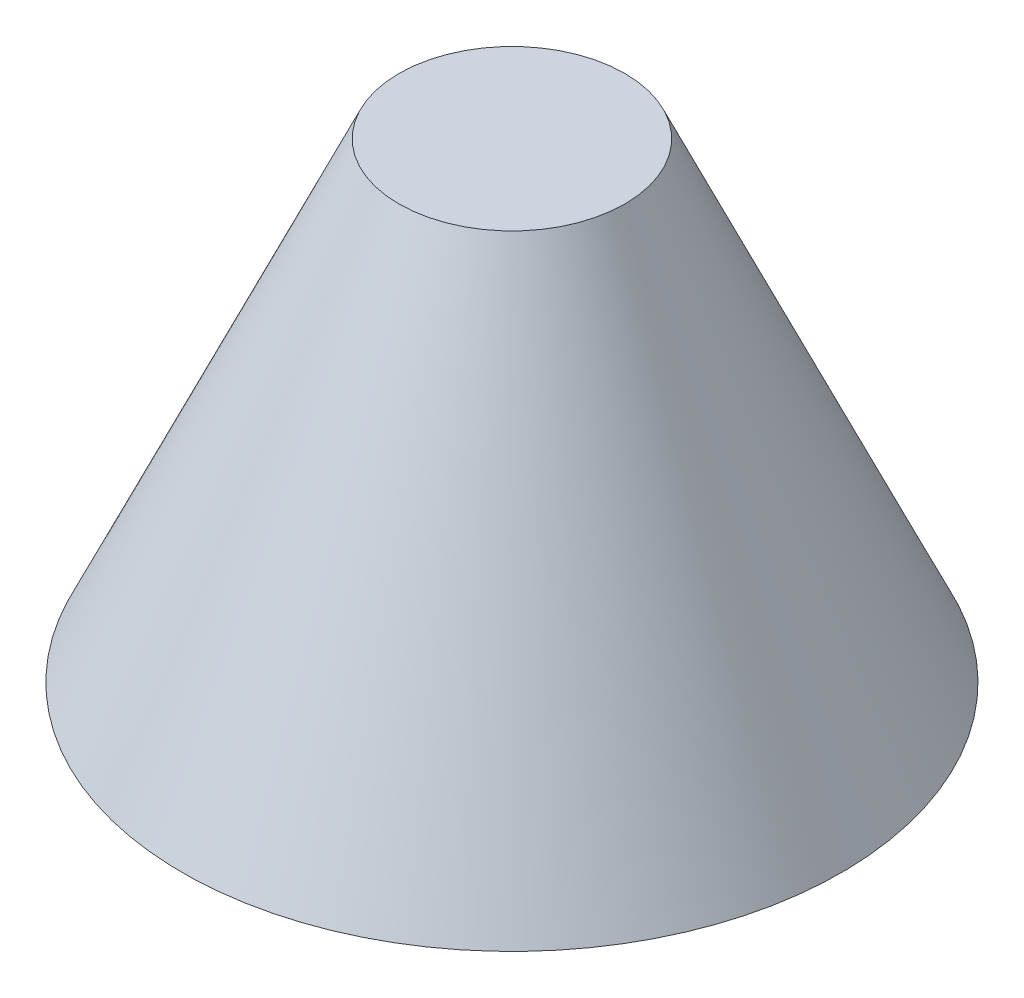
ISO-10303-21;
HEADER;
FILE_DESCRIPTION(('STEP AP214'),'2;1');
FILE_NAME('part.step','',(''),(''),'','','');
FILE_SCHEMA(('AUTOMOTIVE_DESIGN { 1 0 10303 214 1 1 1 1 }'));
ENDSEC;
DATA;
#1=APPLICATION_CONTEXT('core data for automotive mechanical design processes');
#2=APPLICATION_PROTOCOL_DEFINITION('international standard','automotive_design',2000,#1);
#3=PRODUCT_CONTEXT('',#1,'mechanical');
#4=PRODUCT('Part','Part','',(#3));
#5=PRODUCT_RELATED_PRODUCT_CATEGORY('part','',(#4));
#6=PRODUCT_DEFINITION_FORMATION('','',#4);
#7=PRODUCT_DEFINITION_CONTEXT('part definition',#1,'design');
#8=PRODUCT_DEFINITION('design','',#6,#7);
#9=PRODUCT_DEFINITION_SHAPE('','',#8);
#10=(LENGTH_UNIT() NAMED_UNIT(*) SI_UNIT(.MILLI.,.METRE.));
#11=(NAMED_UNIT(*) PLANE_ANGLE_UNIT() SI_UNIT($,.RADIAN.));
#12=(NAMED_UNIT(*) SI_UNIT($,.STERADIAN.) SOLID_ANGLE_UNIT());
#13=UNCERTAINTY_MEASURE_WITH_UNIT(LENGTH_MEASURE(1.E-05),#10,'distance_accuracy_value','');
#14=(GEOMETRIC_REPRESENTATION_CONTEXT(3) GLOBAL_UNCERTAINTY_ASSIGNED_CONTEXT((#13)) GLOBAL_UNIT_ASSIGNED_CONTEXT((#10,
#11,#12)) REPRESENTATION_CONTEXT('',''));
#15=CARTESIAN_POINT('',(0.,0.,0.));
#16=DIRECTION('',(0.,0.,1.));
#17=DIRECTION('',(1.,0.,0.));
#18=AXIS2_PLACEMENT_3D('',#15,#16,#17);
#19=CARTESIAN_POINT('',(0.,0.,0.));
#20=DIRECTION('',(0.,-1.,0.));
#21=DIRECTION('',(0.,0.,-1.));
#22=AXIS2_PLACEMENT_3D('',#19,#20,#21);
#23=PLANE('',#22);
#24=CARTESIAN_POINT('',(0.,0.,0.));
#25=DIRECTION('',(0.,-1.,0.));
#26=DIRECTION('',(0.,0.,-1.));
#27=AXIS2_PLACEMENT_3D('',#24,#25,#26);
#28=CIRCLE('',#27,35.);
#29=CARTESIAN_POINT('',(0.,0.,-35.));
#30=VERTEX_POINT('',#29);
#31=EDGE_CURVE('E10',#30,#30,#28,.T.);
#32=ORIENTED_EDGE('',*,*,#31,.T.);
#33=EDGE_LOOP('',(#32));
#34=FACE_BOUND('',#33,.T.);
#35=ADVANCED_FACE('F39',(#34),#23,.T.);
#36=CARTESIAN_POINT('',(0.,0.,0.));
#37=DIRECTION('',(0.,-1.,0.));
#38=DIRECTION('',(0.,0.,-1.));
#39=AXIS2_PLACEMENT_3D('',#36,#37,#38);
#40=CONICAL_SURFACE('',#39,35.,0.431138740718782);
#41=CARTESIAN_POINT('',(0.,50.,0.));
#42=DIRECTION('',(0.,-1.,0.));
#43=DIRECTION('',(0.,0.,-1.));
#44=AXIS2_PLACEMENT_3D('',#41,#42,#43);
#45=CIRCLE('',#44,12.);
#46=CARTESIAN_POINT('',(0.,50.,-12.));
#47=VERTEX_POINT('',#46);
#48=EDGE_CURVE('E45',#47,#47,#45,.T.);
#49=ORIENTED_EDGE('',*,*,#48,.T.);
#50=EDGE_LOOP('',(#49));
#51=FACE_BOUND('',#50,.T.);
#52=ORIENTED_EDGE('',*,*,#31,.F.);
#53=EDGE_LOOP('',(#52));
#54=FACE_BOUND('',#53,.T.);
#55=ADVANCED_FACE('F51',(#51,#54),#40,.T.);
#56=CARTESIAN_POINT('',(12.,50.,0.));
#57=DIRECTION('',(0.,1.,0.));
#58=DIRECTION('',(0.,0.,1.));
#59=AXIS2_PLACEMENT_3D('',#56,#57,#58);
#60=PLANE('',#59);
#61=ORIENTED_EDGE('',*,*,#48,.F.);
#62=EDGE_LOOP('',(#61));
#63=FACE_BOUND('',#62,.T.);
#64=ADVANCED_FACE('F54',(#63),#60,.T.);
#65=CLOSED_SHELL('',(#35,#55,#64));
#66=MANIFOLD_SOLID_BREP('B2',#65);
#67=ADVANCED_BREP_SHAPE_REPRESENTATION('',(#18,#66),#14);
#68=SHAPE_DEFINITION_REPRESENTATION(#9,#67);
ENDSEC;
END-ISO-10303-21;
